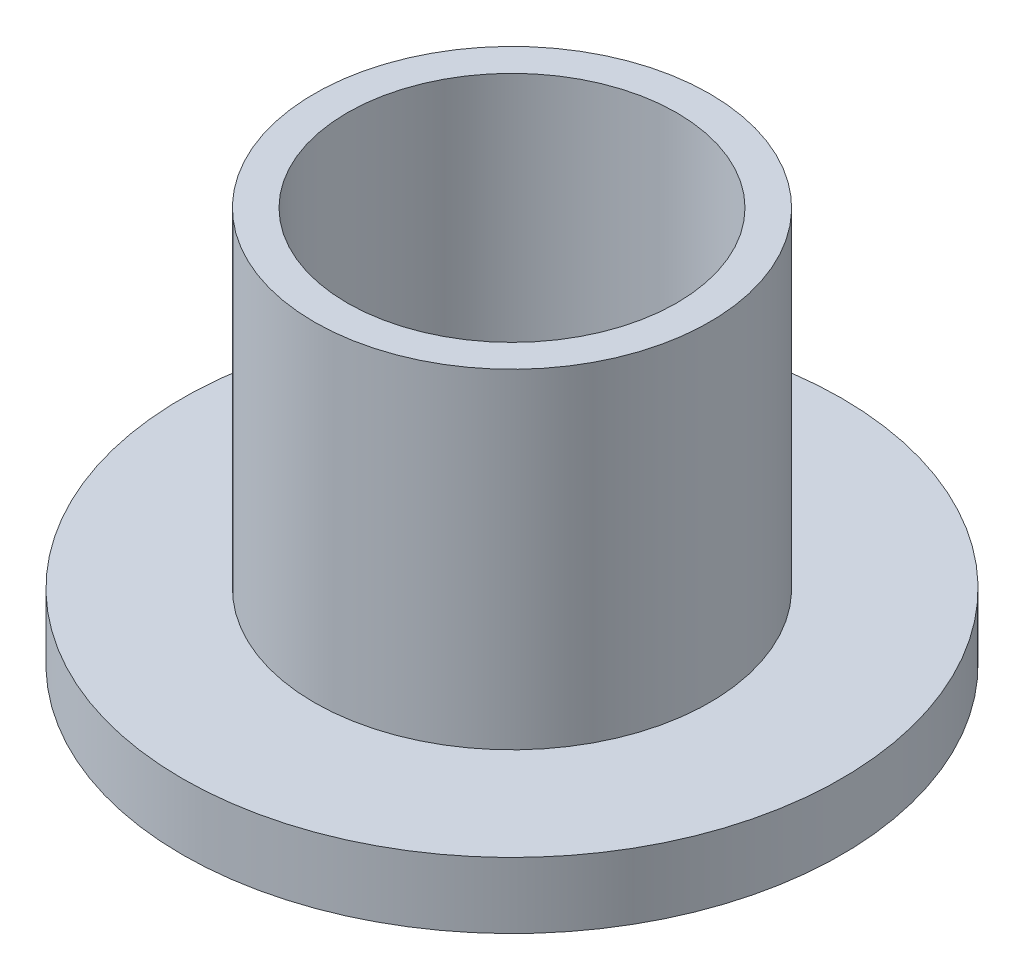
ISO-10303-21;
HEADER;
FILE_DESCRIPTION(('STEP AP214'),'2;1');
FILE_NAME('part.step','',(''),(''),'','','');
FILE_SCHEMA(('AUTOMOTIVE_DESIGN { 1 0 10303 214 1 1 1 1 }'));
ENDSEC;
DATA;
#1=APPLICATION_CONTEXT('core data for automotive mechanical design processes');
#2=APPLICATION_PROTOCOL_DEFINITION('international standard','automotive_design',2000,#1);
#3=PRODUCT_CONTEXT('',#1,'mechanical');
#4=PRODUCT('Part','Part','',(#3));
#5=PRODUCT_RELATED_PRODUCT_CATEGORY('part','',(#4));
#6=PRODUCT_DEFINITION_FORMATION('','',#4);
#7=PRODUCT_DEFINITION_CONTEXT('part definition',#1,'design');
#8=PRODUCT_DEFINITION('design','',#6,#7);
#9=PRODUCT_DEFINITION_SHAPE('','',#8);
#10=(LENGTH_UNIT() NAMED_UNIT(*) SI_UNIT(.MILLI.,.METRE.));
#11=(NAMED_UNIT(*) PLANE_ANGLE_UNIT() SI_UNIT($,.RADIAN.));
#12=(NAMED_UNIT(*) SI_UNIT($,.STERADIAN.) SOLID_ANGLE_UNIT());
#13=UNCERTAINTY_MEASURE_WITH_UNIT(LENGTH_MEASURE(1.E-05),#10,'distance_accuracy_value','');
#14=(GEOMETRIC_REPRESENTATION_CONTEXT(3) GLOBAL_UNCERTAINTY_ASSIGNED_CONTEXT((#13)) GLOBAL_UNIT_ASSIGNED_CONTEXT((#10,
#11,#12)) REPRESENTATION_CONTEXT('',''));
#15=CARTESIAN_POINT('',(0.,0.,0.));
#16=DIRECTION('',(0.,0.,1.));
#17=DIRECTION('',(1.,0.,0.));
#18=AXIS2_PLACEMENT_3D('',#15,#16,#17);
#19=CARTESIAN_POINT('',(5.,0.,0.));
#20=DIRECTION('',(0.,-1.,0.));
#21=DIRECTION('',(0.,0.,-1.));
#22=AXIS2_PLACEMENT_3D('',#19,#20,#21);
#23=PLANE('',#22);
#24=CARTESIAN_POINT('',(0.,0.,0.));
#25=DIRECTION('',(0.,-1.,0.));
#26=DIRECTION('',(0.,0.,-1.));
#27=AXIS2_PLACEMENT_3D('',#24,#25,#26);
#28=CIRCLE('',#27,5.);
#29=CARTESIAN_POINT('',(0.,0.,-5.));
#30=VERTEX_POINT('',#29);
#31=EDGE_CURVE('E55',#30,#30,#28,.T.);
#32=ORIENTED_EDGE('',*,*,#31,.T.);
#33=EDGE_LOOP('',(#32));
#34=FACE_BOUND('',#33,.T.);
#35=CARTESIAN_POINT('',(0.,0.,0.));
#36=DIRECTION('',(0.,-1.,0.));
#37=DIRECTION('',(0.,0.,-1.));
#38=AXIS2_PLACEMENT_3D('',#35,#36,#37);
#39=CIRCLE('',#38,2.5);
#40=CARTESIAN_POINT('',(0.,0.,-2.5));
#41=VERTEX_POINT('',#40);
#42=EDGE_CURVE('E10',#41,#41,#39,.T.);
#43=ORIENTED_EDGE('',*,*,#42,.F.);
#44=EDGE_LOOP('',(#43));
#45=FACE_BOUND('',#44,.T.);
#46=ADVANCED_FACE('F33',(#34,#45),#23,.T.);
#47=CARTESIAN_POINT('',(0.,0.,0.));
#48=DIRECTION('',(0.,-1.,0.));
#49=DIRECTION('',(0.,0.,-1.));
#50=AXIS2_PLACEMENT_3D('',#47,#48,#49);
#51=CYLINDRICAL_SURFACE('',#50,2.5);
#52=ORIENTED_EDGE('',*,*,#42,.T.);
#53=EDGE_LOOP('',(#52));
#54=FACE_BOUND('',#53,.T.);
#55=CARTESIAN_POINT('',(0.,6.,0.));
#56=DIRECTION('',(0.,-1.,0.));
#57=DIRECTION('',(0.,0.,-1.));
#58=AXIS2_PLACEMENT_3D('',#55,#56,#57);
#59=CIRCLE('',#58,2.5);
#60=CARTESIAN_POINT('',(0.,6.,-2.5));
#61=VERTEX_POINT('',#60);
#62=EDGE_CURVE('E39',#61,#61,#59,.T.);
#63=ORIENTED_EDGE('',*,*,#62,.F.);
#64=EDGE_LOOP('',(#63));
#65=FACE_BOUND('',#64,.T.);
#66=ADVANCED_FACE('F73',(#54,#65),#51,.F.);
#67=CARTESIAN_POINT('',(2.5,6.,0.));
#68=DIRECTION('',(0.,1.,0.));
#69=DIRECTION('',(0.,0.,1.));
#70=AXIS2_PLACEMENT_3D('',#67,#68,#69);
#71=PLANE('',#70);
#72=ORIENTED_EDGE('',*,*,#62,.T.);
#73=EDGE_LOOP('',(#72));
#74=FACE_BOUND('',#73,.T.);
#75=CARTESIAN_POINT('',(0.,6.,0.));
#76=DIRECTION('',(0.,-1.,0.));
#77=DIRECTION('',(0.,0.,-1.));
#78=AXIS2_PLACEMENT_3D('',#75,#76,#77);
#79=CIRCLE('',#78,3.);
#80=CARTESIAN_POINT('',(0.,6.,-3.));
#81=VERTEX_POINT('',#80);
#82=EDGE_CURVE('E43',#81,#81,#79,.T.);
#83=ORIENTED_EDGE('',*,*,#82,.F.);
#84=EDGE_LOOP('',(#83));
#85=FACE_BOUND('',#84,.T.);
#86=ADVANCED_FACE('F77',(#74,#85),#71,.T.);
#87=CARTESIAN_POINT('',(0.,0.,0.));
#88=DIRECTION('',(0.,-1.,0.));
#89=DIRECTION('',(0.,0.,-1.));
#90=AXIS2_PLACEMENT_3D('',#87,#88,#89);
#91=CYLINDRICAL_SURFACE('',#90,3.);
#92=ORIENTED_EDGE('',*,*,#82,.T.);
#93=EDGE_LOOP('',(#92));
#94=FACE_BOUND('',#93,.T.);
#95=CARTESIAN_POINT('',(0.,1.,0.));
#96=DIRECTION('',(0.,-1.,0.));
#97=DIRECTION('',(0.,0.,-1.));
#98=AXIS2_PLACEMENT_3D('',#95,#96,#97);
#99=CIRCLE('',#98,3.);
#100=CARTESIAN_POINT('',(0.,1.,-3.));
#101=VERTEX_POINT('',#100);
#102=EDGE_CURVE('E47',#101,#101,#99,.T.);
#103=ORIENTED_EDGE('',*,*,#102,.F.);
#104=EDGE_LOOP('',(#103));
#105=FACE_BOUND('',#104,.T.);
#106=ADVANCED_FACE('F69',(#94,#105),#91,.T.);
#107=CARTESIAN_POINT('',(3.,1.,0.));
#108=DIRECTION('',(0.,1.,0.));
#109=DIRECTION('',(0.,0.,1.));
#110=AXIS2_PLACEMENT_3D('',#107,#108,#109);
#111=PLANE('',#110);
#112=ORIENTED_EDGE('',*,*,#102,.T.);
#113=EDGE_LOOP('',(#112));
#114=FACE_BOUND('',#113,.T.);
#115=CARTESIAN_POINT('',(0.,1.,0.));
#116=DIRECTION('',(0.,-1.,0.));
#117=DIRECTION('',(0.,0.,-1.));
#118=AXIS2_PLACEMENT_3D('',#115,#116,#117);
#119=CIRCLE('',#118,5.);
#120=CARTESIAN_POINT('',(0.,1.,-5.));
#121=VERTEX_POINT('',#120);
#122=EDGE_CURVE('E52',#121,#121,#119,.T.);
#123=ORIENTED_EDGE('',*,*,#122,.F.);
#124=EDGE_LOOP('',(#123));
#125=FACE_BOUND('',#124,.T.);
#126=ADVANCED_FACE('F63',(#114,#125),#111,.T.);
#127=CARTESIAN_POINT('',(0.,0.,0.));
#128=DIRECTION('',(0.,-1.,0.));
#129=DIRECTION('',(0.,0.,-1.));
#130=AXIS2_PLACEMENT_3D('',#127,#128,#129);
#131=CYLINDRICAL_SURFACE('',#130,5.);
#132=ORIENTED_EDGE('',*,*,#122,.T.);
#133=EDGE_LOOP('',(#132));
#134=FACE_BOUND('',#133,.T.);
#135=ORIENTED_EDGE('',*,*,#31,.F.);
#136=EDGE_LOOP('',(#135));
#137=FACE_BOUND('',#136,.T.);
#138=ADVANCED_FACE('F61',(#134,#137),#131,.T.);
#139=CLOSED_SHELL('',(#46,#66,#86,#106,#126,#138));
#140=MANIFOLD_SOLID_BREP('B2',#139);
#141=ADVANCED_BREP_SHAPE_REPRESENTATION('',(#18,#140),#14);
#142=SHAPE_DEFINITION_REPRESENTATION(#9,#141);
ENDSEC;
END-ISO-10303-21;
